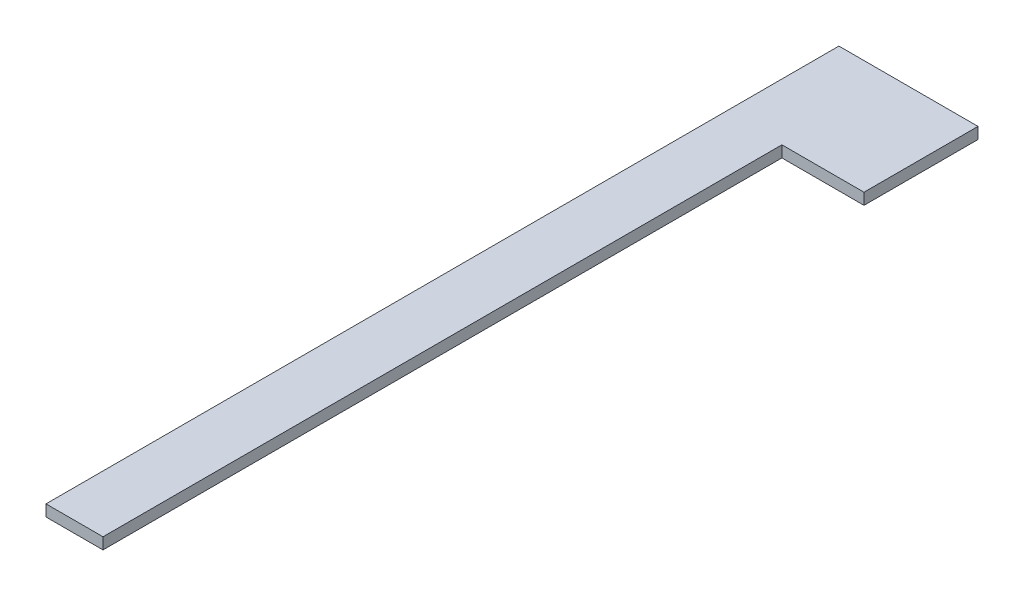
ISO-10303-21;
HEADER;
FILE_DESCRIPTION(('STEP AP214'),'2;1');
FILE_NAME('part.step','',(''),(''),'','','');
FILE_SCHEMA(('AUTOMOTIVE_DESIGN { 1 0 10303 214 1 1 1 1 }'));
ENDSEC;
DATA;
#1=APPLICATION_CONTEXT('core data for automotive mechanical design processes');
#2=APPLICATION_PROTOCOL_DEFINITION('international standard','automotive_design',2000,#1);
#3=PRODUCT_CONTEXT('',#1,'mechanical');
#4=PRODUCT('Part','Part','',(#3));
#5=PRODUCT_RELATED_PRODUCT_CATEGORY('part','',(#4));
#6=PRODUCT_DEFINITION_FORMATION('','',#4);
#7=PRODUCT_DEFINITION_CONTEXT('part definition',#1,'design');
#8=PRODUCT_DEFINITION('design','',#6,#7);
#9=PRODUCT_DEFINITION_SHAPE('','',#8);
#10=(LENGTH_UNIT() NAMED_UNIT(*) SI_UNIT(.MILLI.,.METRE.));
#11=(NAMED_UNIT(*) PLANE_ANGLE_UNIT() SI_UNIT($,.RADIAN.));
#12=(NAMED_UNIT(*) SI_UNIT($,.STERADIAN.) SOLID_ANGLE_UNIT());
#13=UNCERTAINTY_MEASURE_WITH_UNIT(LENGTH_MEASURE(1.E-05),#10,'distance_accuracy_value','');
#14=(GEOMETRIC_REPRESENTATION_CONTEXT(3) GLOBAL_UNCERTAINTY_ASSIGNED_CONTEXT((#13)) GLOBAL_UNIT_ASSIGNED_CONTEXT((#10,
#11,#12)) REPRESENTATION_CONTEXT('',''));
#15=CARTESIAN_POINT('',(0.,0.,0.));
#16=DIRECTION('',(0.,0.,1.));
#17=DIRECTION('',(1.,0.,0.));
#18=AXIS2_PLACEMENT_3D('',#15,#16,#17);
#19=CARTESIAN_POINT('',(-5.04457831325296,1.,0.));
#20=DIRECTION('',(1.,0.,0.));
#21=DIRECTION('',(0.,0.,-1.));
#22=AXIS2_PLACEMENT_3D('',#19,#20,#21);
#23=PLANE('',#22);
#24=DIRECTION('',(0.,0.,1.));
#25=VECTOR('',#24,1.);
#26=CARTESIAN_POINT('',(-5.04457831325296,0.,0.));
#27=LINE('',#26,#25);
#28=CARTESIAN_POINT('',(-5.04457831325296,0.,31.9274096385542));
#29=VERTEX_POINT('',#28);
#30=CARTESIAN_POINT('',(-5.04457831325296,0.,91.4774096385542));
#31=VERTEX_POINT('',#30);
#32=EDGE_CURVE('E117',#29,#31,#27,.T.);
#33=ORIENTED_EDGE('',*,*,#32,.F.);
#34=DIRECTION('',(0.,-1.,0.));
#35=VECTOR('',#34,1.);
#36=CARTESIAN_POINT('',(-5.04457831325296,1.,31.9274096385542));
#37=LINE('',#36,#35);
#38=CARTESIAN_POINT('',(-5.04457831325296,1.,31.9274096385542));
#39=VERTEX_POINT('',#38);
#40=EDGE_CURVE('E11',#39,#29,#37,.T.);
#41=ORIENTED_EDGE('',*,*,#40,.F.);
#42=DIRECTION('',(0.,0.,1.));
#43=VECTOR('',#42,1.);
#44=CARTESIAN_POINT('',(-5.04457831325296,1.,0.));
#45=LINE('',#44,#43);
#46=CARTESIAN_POINT('',(-5.04457831325296,1.,91.4774096385542));
#47=VERTEX_POINT('',#46);
#48=EDGE_CURVE('E129',#39,#47,#45,.T.);
#49=ORIENTED_EDGE('',*,*,#48,.T.);
#50=DIRECTION('',(0.,-1.,0.));
#51=VECTOR('',#50,1.);
#52=CARTESIAN_POINT('',(-5.04457831325296,1.,91.4774096385542));
#53=LINE('',#52,#51);
#54=EDGE_CURVE('E79',#47,#31,#53,.T.);
#55=ORIENTED_EDGE('',*,*,#54,.T.);
#56=EDGE_LOOP('',(#33,#41,#49,#55));
#57=FACE_BOUND('',#56,.T.);
#58=ADVANCED_FACE('F35',(#57),#23,.T.);
#59=CARTESIAN_POINT('',(0.,1.,31.9274096385542));
#60=DIRECTION('',(0.,0.,-1.));
#61=DIRECTION('',(-1.,0.,0.));
#62=AXIS2_PLACEMENT_3D('',#59,#60,#61);
#63=PLANE('',#62);
#64=DIRECTION('',(1.,0.,0.));
#65=VECTOR('',#64,1.);
#66=CARTESIAN_POINT('',(0.,0.,31.9274096385542));
#67=LINE('',#66,#65);
#68=CARTESIAN_POINT('',(2.15542168674703,0.,31.9274096385542));
#69=VERTEX_POINT('',#68);
#70=EDGE_CURVE('E120',#29,#69,#67,.T.);
#71=ORIENTED_EDGE('',*,*,#70,.T.);
#72=DIRECTION('',(0.,-1.,0.));
#73=VECTOR('',#72,1.);
#74=CARTESIAN_POINT('',(2.15542168674703,1.,31.9274096385542));
#75=LINE('',#74,#73);
#76=CARTESIAN_POINT('',(2.15542168674703,1.,31.9274096385542));
#77=VERTEX_POINT('',#76);
#78=EDGE_CURVE('E43',#77,#69,#75,.T.);
#79=ORIENTED_EDGE('',*,*,#78,.F.);
#80=DIRECTION('',(1.,0.,0.));
#81=VECTOR('',#80,1.);
#82=CARTESIAN_POINT('',(0.,1.,31.9274096385542));
#83=LINE('',#82,#81);
#84=EDGE_CURVE('E112',#39,#77,#83,.T.);
#85=ORIENTED_EDGE('',*,*,#84,.F.);
#86=ORIENTED_EDGE('',*,*,#40,.T.);
#87=EDGE_LOOP('',(#71,#79,#85,#86));
#88=FACE_BOUND('',#87,.T.);
#89=ADVANCED_FACE('F145',(#88),#63,.F.);
#90=CARTESIAN_POINT('',(2.15542168674703,1.,0.));
#91=DIRECTION('',(-1.,0.,0.));
#92=DIRECTION('',(0.,0.,1.));
#93=AXIS2_PLACEMENT_3D('',#90,#91,#92);
#94=PLANE('',#93);
#95=DIRECTION('',(0.,0.,-1.));
#96=VECTOR('',#95,1.);
#97=CARTESIAN_POINT('',(2.15542168674703,0.,0.));
#98=LINE('',#97,#96);
#99=CARTESIAN_POINT('',(2.15542168674703,0.,21.9274096385542));
#100=VERTEX_POINT('',#99);
#101=EDGE_CURVE('E122',#69,#100,#98,.T.);
#102=ORIENTED_EDGE('',*,*,#101,.T.);
#103=DIRECTION('',(0.,-1.,0.));
#104=VECTOR('',#103,1.);
#105=CARTESIAN_POINT('',(2.15542168674703,1.,21.9274096385542));
#106=LINE('',#105,#104);
#107=CARTESIAN_POINT('',(2.15542168674703,1.,21.9274096385542));
#108=VERTEX_POINT('',#107);
#109=EDGE_CURVE('E101',#108,#100,#106,.T.);
#110=ORIENTED_EDGE('',*,*,#109,.F.);
#111=DIRECTION('',(0.,0.,-1.));
#112=VECTOR('',#111,1.);
#113=CARTESIAN_POINT('',(2.15542168674703,1.,0.));
#114=LINE('',#113,#112);
#115=EDGE_CURVE('E109',#77,#108,#114,.T.);
#116=ORIENTED_EDGE('',*,*,#115,.F.);
#117=ORIENTED_EDGE('',*,*,#78,.T.);
#118=EDGE_LOOP('',(#102,#110,#116,#117));
#119=FACE_BOUND('',#118,.T.);
#120=ADVANCED_FACE('F136',(#119),#94,.F.);
#121=CARTESIAN_POINT('',(0.,1.,21.9274096385542));
#122=DIRECTION('',(0.,0.,-1.));
#123=DIRECTION('',(-1.,0.,0.));
#124=AXIS2_PLACEMENT_3D('',#121,#122,#123);
#125=PLANE('',#124);
#126=DIRECTION('',(1.,0.,0.));
#127=VECTOR('',#126,1.);
#128=CARTESIAN_POINT('',(0.,0.,21.9274096385542));
#129=LINE('',#128,#127);
#130=CARTESIAN_POINT('',(-10.044578313253,0.,21.9274096385542));
#131=VERTEX_POINT('',#130);
#132=EDGE_CURVE('E100',#131,#100,#129,.T.);
#133=ORIENTED_EDGE('',*,*,#132,.F.);
#134=DIRECTION('',(0.,-1.,0.));
#135=VECTOR('',#134,1.);
#136=CARTESIAN_POINT('',(-10.044578313253,1.,21.9274096385542));
#137=LINE('',#136,#135);
#138=CARTESIAN_POINT('',(-10.044578313253,1.,21.9274096385542));
#139=VERTEX_POINT('',#138);
#140=EDGE_CURVE('E94',#139,#131,#137,.T.);
#141=ORIENTED_EDGE('',*,*,#140,.F.);
#142=DIRECTION('',(1.,0.,0.));
#143=VECTOR('',#142,1.);
#144=CARTESIAN_POINT('',(0.,1.,21.9274096385542));
#145=LINE('',#144,#143);
#146=EDGE_CURVE('E98',#139,#108,#145,.T.);
#147=ORIENTED_EDGE('',*,*,#146,.T.);
#148=ORIENTED_EDGE('',*,*,#109,.T.);
#149=EDGE_LOOP('',(#133,#141,#147,#148));
#150=FACE_BOUND('',#149,.T.);
#151=ADVANCED_FACE('F96',(#150),#125,.T.);
#152=CARTESIAN_POINT('',(-10.044578313253,1.,0.));
#153=DIRECTION('',(1.,0.,0.));
#154=DIRECTION('',(0.,0.,-1.));
#155=AXIS2_PLACEMENT_3D('',#152,#153,#154);
#156=PLANE('',#155);
#157=DIRECTION('',(0.,0.,1.));
#158=VECTOR('',#157,1.);
#159=CARTESIAN_POINT('',(-10.044578313253,0.,0.));
#160=LINE('',#159,#158);
#161=CARTESIAN_POINT('',(-10.044578313253,0.,91.4774096385542));
#162=VERTEX_POINT('',#161);
#163=EDGE_CURVE('E72',#131,#162,#160,.T.);
#164=ORIENTED_EDGE('',*,*,#163,.T.);
#165=DIRECTION('',(0.,-1.,0.));
#166=VECTOR('',#165,1.);
#167=CARTESIAN_POINT('',(-10.044578313253,1.,91.4774096385542));
#168=LINE('',#167,#166);
#169=CARTESIAN_POINT('',(-10.044578313253,1.,91.4774096385542));
#170=VERTEX_POINT('',#169);
#171=EDGE_CURVE('E102',#170,#162,#168,.T.);
#172=ORIENTED_EDGE('',*,*,#171,.F.);
#173=DIRECTION('',(0.,0.,1.));
#174=VECTOR('',#173,1.);
#175=CARTESIAN_POINT('',(-10.044578313253,1.,0.));
#176=LINE('',#175,#174);
#177=EDGE_CURVE('E104',#139,#170,#176,.T.);
#178=ORIENTED_EDGE('',*,*,#177,.F.);
#179=ORIENTED_EDGE('',*,*,#140,.T.);
#180=EDGE_LOOP('',(#164,#172,#178,#179));
#181=FACE_BOUND('',#180,.T.);
#182=ADVANCED_FACE('F105',(#181),#156,.F.);
#183=CARTESIAN_POINT('',(0.,1.,91.4774096385542));
#184=DIRECTION('',(0.,0.,-1.));
#185=DIRECTION('',(-1.,0.,0.));
#186=AXIS2_PLACEMENT_3D('',#183,#184,#185);
#187=PLANE('',#186);
#188=DIRECTION('',(1.,0.,0.));
#189=VECTOR('',#188,1.);
#190=CARTESIAN_POINT('',(0.,0.,91.4774096385542));
#191=LINE('',#190,#189);
#192=EDGE_CURVE('E127',#162,#31,#191,.T.);
#193=ORIENTED_EDGE('',*,*,#192,.T.);
#194=ORIENTED_EDGE('',*,*,#54,.F.);
#195=DIRECTION('',(1.,0.,0.));
#196=VECTOR('',#195,1.);
#197=CARTESIAN_POINT('',(0.,1.,91.4774096385542));
#198=LINE('',#197,#196);
#199=EDGE_CURVE('E51',#170,#47,#198,.T.);
#200=ORIENTED_EDGE('',*,*,#199,.F.);
#201=ORIENTED_EDGE('',*,*,#171,.T.);
#202=EDGE_LOOP('',(#193,#194,#200,#201));
#203=FACE_BOUND('',#202,.T.);
#204=ADVANCED_FACE('F143',(#203),#187,.F.);
#205=CARTESIAN_POINT('',(0.,1.,0.));
#206=DIRECTION('',(0.,1.,0.));
#207=DIRECTION('',(0.,0.,1.));
#208=AXIS2_PLACEMENT_3D('',#205,#206,#207);
#209=PLANE('',#208);
#210=ORIENTED_EDGE('',*,*,#48,.F.);
#211=ORIENTED_EDGE('',*,*,#84,.T.);
#212=ORIENTED_EDGE('',*,*,#115,.T.);
#213=ORIENTED_EDGE('',*,*,#146,.F.);
#214=ORIENTED_EDGE('',*,*,#177,.T.);
#215=ORIENTED_EDGE('',*,*,#199,.T.);
#216=EDGE_LOOP('',(#210,#211,#212,#213,#214,#215));
#217=FACE_BOUND('',#216,.T.);
#218=ADVANCED_FACE('F107',(#217),#209,.T.);
#219=CARTESIAN_POINT('',(0.,0.,0.));
#220=DIRECTION('',(0.,1.,0.));
#221=DIRECTION('',(0.,0.,1.));
#222=AXIS2_PLACEMENT_3D('',#219,#220,#221);
#223=PLANE('',#222);
#224=ORIENTED_EDGE('',*,*,#32,.T.);
#225=ORIENTED_EDGE('',*,*,#192,.F.);
#226=ORIENTED_EDGE('',*,*,#163,.F.);
#227=ORIENTED_EDGE('',*,*,#132,.T.);
#228=ORIENTED_EDGE('',*,*,#101,.F.);
#229=ORIENTED_EDGE('',*,*,#70,.F.);
#230=EDGE_LOOP('',(#224,#225,#226,#227,#228,#229));
#231=FACE_BOUND('',#230,.T.);
#232=ADVANCED_FACE('F140',(#231),#223,.F.);
#233=CLOSED_SHELL('',(#58,#89,#120,#151,#182,#204,#218,#232));
#234=MANIFOLD_SOLID_BREP('B2',#233);
#235=ADVANCED_BREP_SHAPE_REPRESENTATION('',(#18,#234),#14);
#236=SHAPE_DEFINITION_REPRESENTATION(#9,#235);
ENDSEC;
END-ISO-10303-21;
